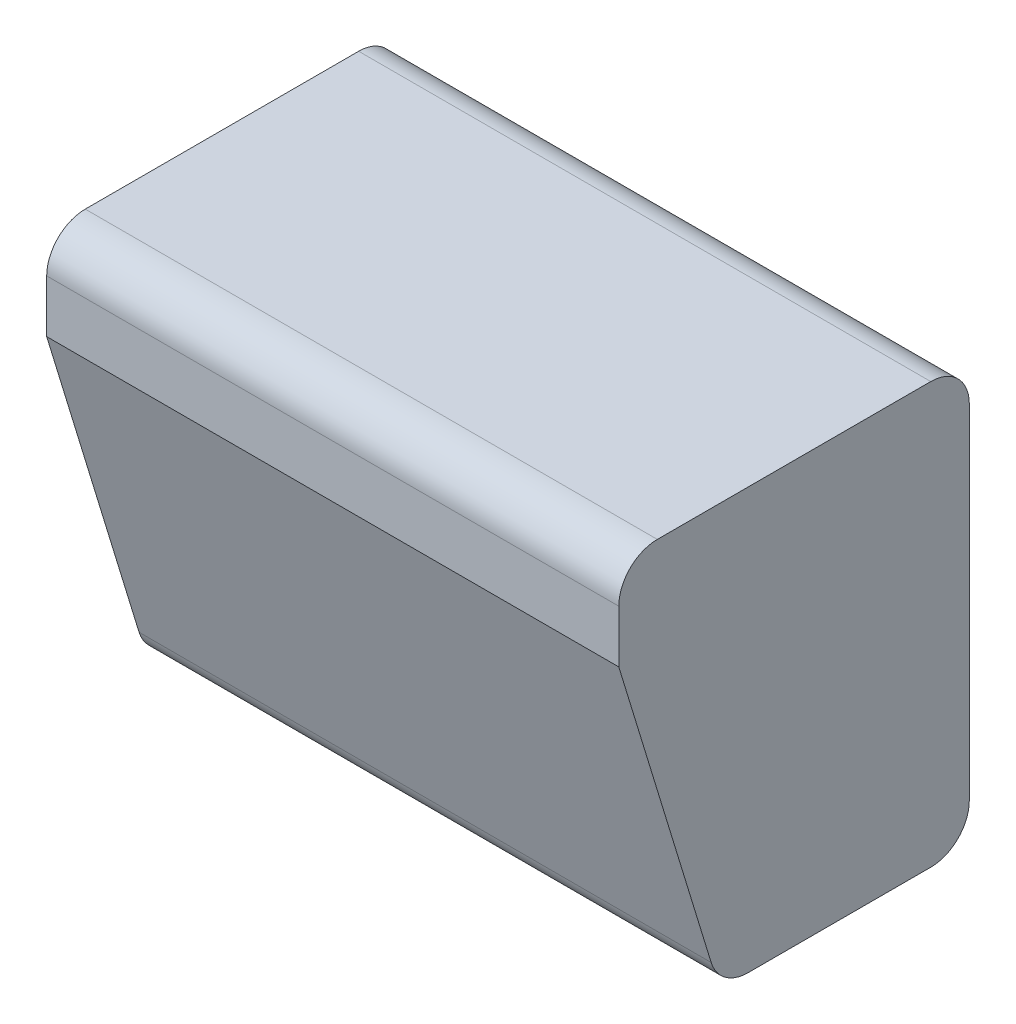
ISO-10303-21;
HEADER;
FILE_DESCRIPTION(('STEP AP214'),'2;1');
FILE_NAME('part.step','',(''),(''),'','','');
FILE_SCHEMA(('AUTOMOTIVE_DESIGN { 1 0 10303 214 1 1 1 1 }'));
ENDSEC;
DATA;
#1=APPLICATION_CONTEXT('core data for automotive mechanical design processes');
#2=APPLICATION_PROTOCOL_DEFINITION('international standard','automotive_design',2000,#1);
#3=PRODUCT_CONTEXT('',#1,'mechanical');
#4=PRODUCT('Part','Part','',(#3));
#5=PRODUCT_RELATED_PRODUCT_CATEGORY('part','',(#4));
#6=PRODUCT_DEFINITION_FORMATION('','',#4);
#7=PRODUCT_DEFINITION_CONTEXT('part definition',#1,'design');
#8=PRODUCT_DEFINITION('design','',#6,#7);
#9=PRODUCT_DEFINITION_SHAPE('','',#8);
#10=(LENGTH_UNIT() NAMED_UNIT(*) SI_UNIT(.MILLI.,.METRE.));
#11=(NAMED_UNIT(*) PLANE_ANGLE_UNIT() SI_UNIT($,.RADIAN.));
#12=(NAMED_UNIT(*) SI_UNIT($,.STERADIAN.) SOLID_ANGLE_UNIT());
#13=UNCERTAINTY_MEASURE_WITH_UNIT(LENGTH_MEASURE(1.E-05),#10,'distance_accuracy_value','');
#14=(GEOMETRIC_REPRESENTATION_CONTEXT(3) GLOBAL_UNCERTAINTY_ASSIGNED_CONTEXT((#13)) GLOBAL_UNIT_ASSIGNED_CONTEXT((#10,
#11,#12)) REPRESENTATION_CONTEXT('',''));
#15=CARTESIAN_POINT('',(0.,0.,0.));
#16=DIRECTION('',(0.,0.,1.));
#17=DIRECTION('',(1.,0.,0.));
#18=AXIS2_PLACEMENT_3D('',#15,#16,#17);
#19=CARTESIAN_POINT('',(81.6,15.1523642732049,27.3204903677758));
#20=DIRECTION('',(0.,0.,-1.));
#21=DIRECTION('',(-1.,0.,0.));
#22=AXIS2_PLACEMENT_3D('',#19,#20,#21);
#23=PLANE('',#22);
#24=DIRECTION('',(0.,-1.,0.));
#25=VECTOR('',#24,1.);
#26=CARTESIAN_POINT('',(81.6,15.1523642732049,27.3204903677758));
#27=LINE('',#26,#25);
#28=CARTESIAN_POINT('',(81.6,22.6523642732049,27.3204903677758));
#29=VERTEX_POINT('',#28);
#30=CARTESIAN_POINT('',(81.6,15.1523642732049,27.3204903677758));
#31=VERTEX_POINT('',#30);
#32=EDGE_CURVE('E117',#29,#31,#27,.T.);
#33=ORIENTED_EDGE('',*,*,#32,.F.);
#34=DIRECTION('',(-1.,0.,0.));
#35=VECTOR('',#34,1.);
#36=CARTESIAN_POINT('',(81.6,22.6523642732049,27.3204903677758));
#37=LINE('',#36,#35);
#38=CARTESIAN_POINT('',(0.,22.6523642732049,27.3204903677758));
#39=VERTEX_POINT('',#38);
#40=EDGE_CURVE('E11',#29,#39,#37,.T.);
#41=ORIENTED_EDGE('',*,*,#40,.T.);
#42=DIRECTION('',(0.,-1.,0.));
#43=VECTOR('',#42,1.);
#44=CARTESIAN_POINT('',(0.,15.1523642732049,27.3204903677758));
#45=LINE('',#44,#43);
#46=CARTESIAN_POINT('',(0.,15.1523642732049,27.3204903677758));
#47=VERTEX_POINT('',#46);
#48=EDGE_CURVE('E141',#39,#47,#45,.T.);
#49=ORIENTED_EDGE('',*,*,#48,.T.);
#50=DIRECTION('',(-1.,0.,0.));
#51=VECTOR('',#50,1.);
#52=CARTESIAN_POINT('',(81.6,15.1523642732049,27.3204903677758));
#53=LINE('',#52,#51);
#54=EDGE_CURVE('E134',#31,#47,#53,.T.);
#55=ORIENTED_EDGE('',*,*,#54,.F.);
#56=EDGE_LOOP('',(#33,#41,#49,#55));
#57=FACE_BOUND('',#56,.T.);
#58=ADVANCED_FACE('F44',(#57),#23,.F.);
#59=CARTESIAN_POINT('',(81.6,-31.8476357267951,12.9511483392189));
#60=DIRECTION('',(0.,0.292371704722734,-0.956304755963036));
#61=DIRECTION('',(0.,0.956304755963036,0.292371704722734));
#62=AXIS2_PLACEMENT_3D('',#59,#60,#61);
#63=PLANE('',#62);
#64=DIRECTION('',(0.,-0.956304755963036,-0.292371704722734));
#65=VECTOR('',#64,1.);
#66=CARTESIAN_POINT('',(0.,-31.8476357267951,12.9511483392189));
#67=LINE('',#66,#65);
#68=CARTESIAN_POINT('',(0.,-27.9556801027701,14.1410385843589));
#69=VERTEX_POINT('',#68);
#70=EDGE_CURVE('E210',#47,#69,#67,.T.);
#71=ORIENTED_EDGE('',*,*,#70,.T.);
#72=DIRECTION('',(-1.,0.,0.));
#73=VECTOR('',#72,1.);
#74=CARTESIAN_POINT('',(81.6,-27.9556801027701,14.1410385843589));
#75=LINE('',#74,#73);
#76=CARTESIAN_POINT('',(81.6,-27.9556801027701,14.1410385843589));
#77=VERTEX_POINT('',#76);
#78=EDGE_CURVE('E136',#69,#77,#75,.F.);
#79=ORIENTED_EDGE('',*,*,#78,.T.);
#80=DIRECTION('',(0.,-0.956304755963036,-0.292371704722734));
#81=VECTOR('',#80,1.);
#82=CARTESIAN_POINT('',(81.6,-31.8476357267951,12.9511483392189));
#83=LINE('',#82,#81);
#84=EDGE_CURVE('E120',#31,#77,#83,.T.);
#85=ORIENTED_EDGE('',*,*,#84,.F.);
#86=ORIENTED_EDGE('',*,*,#54,.T.);
#87=EDGE_LOOP('',(#71,#79,#85,#86));
#88=FACE_BOUND('',#87,.T.);
#89=ADVANCED_FACE('F133',(#88),#63,.F.);
#90=CARTESIAN_POINT('',(81.6,-31.8476357267951,-22.6795096322242));
#91=DIRECTION('',(0.,1.,0.));
#92=DIRECTION('',(0.,0.,1.));
#93=AXIS2_PLACEMENT_3D('',#90,#91,#92);
#94=PLANE('',#93);
#95=DIRECTION('',(0.,0.,-1.));
#96=VECTOR('',#95,1.);
#97=CARTESIAN_POINT('',(81.6,-31.8476357267951,-22.6795096322242));
#98=LINE('',#97,#96);
#99=CARTESIAN_POINT('',(81.6,-31.8476357267951,8.88136242656225));
#100=VERTEX_POINT('',#99);
#101=CARTESIAN_POINT('',(81.6,-31.8476357267951,-17.1795096322242));
#102=VERTEX_POINT('',#101);
#103=EDGE_CURVE('E138',#100,#102,#98,.T.);
#104=ORIENTED_EDGE('',*,*,#103,.F.);
#105=DIRECTION('',(-1.,0.,0.));
#106=VECTOR('',#105,1.);
#107=CARTESIAN_POINT('',(81.6,-31.8476357267951,8.88136242656225));
#108=LINE('',#107,#106);
#109=CARTESIAN_POINT('',(0.,-31.8476357267951,8.88136242656225));
#110=VERTEX_POINT('',#109);
#111=EDGE_CURVE('E149',#100,#110,#108,.T.);
#112=ORIENTED_EDGE('',*,*,#111,.T.);
#113=DIRECTION('',(0.,0.,-1.));
#114=VECTOR('',#113,1.);
#115=CARTESIAN_POINT('',(0.,-31.8476357267951,-22.6795096322242));
#116=LINE('',#115,#114);
#117=CARTESIAN_POINT('',(0.,-31.8476357267951,-17.1795096322242));
#118=VERTEX_POINT('',#117);
#119=EDGE_CURVE('E205',#110,#118,#116,.T.);
#120=ORIENTED_EDGE('',*,*,#119,.T.);
#121=DIRECTION('',(-1.,0.,0.));
#122=VECTOR('',#121,1.);
#123=CARTESIAN_POINT('',(81.6,-31.8476357267951,-17.1795096322242));
#124=LINE('',#123,#122);
#125=EDGE_CURVE('E144',#118,#102,#124,.F.);
#126=ORIENTED_EDGE('',*,*,#125,.T.);
#127=EDGE_LOOP('',(#104,#112,#120,#126));
#128=FACE_BOUND('',#127,.T.);
#129=ADVANCED_FACE('F231',(#128),#94,.F.);
#130=CARTESIAN_POINT('',(81.6,28.1523642732049,-22.6795096322242));
#131=DIRECTION('',(0.,0.,1.));
#132=DIRECTION('',(0.,-1.,0.));
#133=AXIS2_PLACEMENT_3D('',#130,#131,#132);
#134=PLANE('',#133);
#135=DIRECTION('',(0.,1.,0.));
#136=VECTOR('',#135,1.);
#137=CARTESIAN_POINT('',(81.6,28.1523642732049,-22.6795096322242));
#138=LINE('',#137,#136);
#139=CARTESIAN_POINT('',(81.6,-26.3476357267951,-22.6795096322242));
#140=VERTEX_POINT('',#139);
#141=CARTESIAN_POINT('',(81.6,22.6523642732049,-22.6795096322242));
#142=VERTEX_POINT('',#141);
#143=EDGE_CURVE('E151',#140,#142,#138,.T.);
#144=ORIENTED_EDGE('',*,*,#143,.F.);
#145=DIRECTION('',(-1.,0.,0.));
#146=VECTOR('',#145,1.);
#147=CARTESIAN_POINT('',(81.6,-26.3476357267951,-22.6795096322242));
#148=LINE('',#147,#146);
#149=CARTESIAN_POINT('',(0.,-26.3476357267951,-22.6795096322242));
#150=VERTEX_POINT('',#149);
#151=EDGE_CURVE('E186',#140,#150,#148,.T.);
#152=ORIENTED_EDGE('',*,*,#151,.T.);
#153=DIRECTION('',(0.,1.,0.));
#154=VECTOR('',#153,1.);
#155=CARTESIAN_POINT('',(0.,28.1523642732049,-22.6795096322242));
#156=LINE('',#155,#154);
#157=CARTESIAN_POINT('',(0.,22.6523642732049,-22.6795096322242));
#158=VERTEX_POINT('',#157);
#159=EDGE_CURVE('E203',#150,#158,#156,.T.);
#160=ORIENTED_EDGE('',*,*,#159,.T.);
#161=DIRECTION('',(-1.,0.,0.));
#162=VECTOR('',#161,1.);
#163=CARTESIAN_POINT('',(81.6,22.6523642732049,-22.6795096322242));
#164=LINE('',#163,#162);
#165=EDGE_CURVE('E183',#158,#142,#164,.F.);
#166=ORIENTED_EDGE('',*,*,#165,.T.);
#167=EDGE_LOOP('',(#144,#152,#160,#166));
#168=FACE_BOUND('',#167,.T.);
#169=ADVANCED_FACE('F230',(#168),#134,.F.);
#170=CARTESIAN_POINT('',(81.6,28.1523642732049,27.3204903677758));
#171=DIRECTION('',(0.,-1.,0.));
#172=DIRECTION('',(0.,0.,-1.));
#173=AXIS2_PLACEMENT_3D('',#170,#171,#172);
#174=PLANE('',#173);
#175=DIRECTION('',(0.,0.,1.));
#176=VECTOR('',#175,1.);
#177=CARTESIAN_POINT('',(81.6,28.1523642732049,27.3204903677758));
#178=LINE('',#177,#176);
#179=CARTESIAN_POINT('',(81.6,28.1523642732049,-17.1795096322242));
#180=VERTEX_POINT('',#179);
#181=CARTESIAN_POINT('',(81.6,28.1523642732049,21.8204903677758));
#182=VERTEX_POINT('',#181);
#183=EDGE_CURVE('E145',#180,#182,#178,.T.);
#184=ORIENTED_EDGE('',*,*,#183,.F.);
#185=DIRECTION('',(-1.,0.,0.));
#186=VECTOR('',#185,1.);
#187=CARTESIAN_POINT('',(81.6,28.1523642732049,-17.1795096322242));
#188=LINE('',#187,#186);
#189=CARTESIAN_POINT('',(0.,28.1523642732049,-17.1795096322242));
#190=VERTEX_POINT('',#189);
#191=EDGE_CURVE('E53',#180,#190,#188,.T.);
#192=ORIENTED_EDGE('',*,*,#191,.T.);
#193=DIRECTION('',(0.,0.,1.));
#194=VECTOR('',#193,1.);
#195=CARTESIAN_POINT('',(0.,28.1523642732049,27.3204903677758));
#196=LINE('',#195,#194);
#197=CARTESIAN_POINT('',(0.,28.1523642732049,21.8204903677758));
#198=VERTEX_POINT('',#197);
#199=EDGE_CURVE('E128',#190,#198,#196,.T.);
#200=ORIENTED_EDGE('',*,*,#199,.T.);
#201=DIRECTION('',(-1.,0.,0.));
#202=VECTOR('',#201,1.);
#203=CARTESIAN_POINT('',(81.6,28.1523642732049,21.8204903677758));
#204=LINE('',#203,#202);
#205=EDGE_CURVE('E60',#198,#182,#204,.F.);
#206=ORIENTED_EDGE('',*,*,#205,.T.);
#207=EDGE_LOOP('',(#184,#192,#200,#206));
#208=FACE_BOUND('',#207,.T.);
#209=ADVANCED_FACE('F195',(#208),#174,.F.);
#210=CARTESIAN_POINT('',(81.6,0.,0.));
#211=DIRECTION('',(-1.,0.,0.));
#212=DIRECTION('',(0.,0.,1.));
#213=AXIS2_PLACEMENT_3D('',#210,#211,#212);
#214=PLANE('',#213);
#215=ORIENTED_EDGE('',*,*,#84,.T.);
#216=CARTESIAN_POINT('',(81.6,-26.3476357267951,8.88136242656225));
#217=DIRECTION('',(-1.,0.,0.));
#218=DIRECTION('',(0.,0.,1.));
#219=AXIS2_PLACEMENT_3D('',#216,#217,#218);
#220=CIRCLE('',#219,5.5);
#221=EDGE_CURVE('E180',#77,#100,#220,.F.);
#222=ORIENTED_EDGE('',*,*,#221,.T.);
#223=ORIENTED_EDGE('',*,*,#103,.T.);
#224=CARTESIAN_POINT('',(81.6,-26.3476357267951,-17.1795096322242));
#225=DIRECTION('',(-1.,0.,0.));
#226=DIRECTION('',(0.,0.,1.));
#227=AXIS2_PLACEMENT_3D('',#224,#225,#226);
#228=CIRCLE('',#227,5.5);
#229=EDGE_CURVE('E177',#102,#140,#228,.F.);
#230=ORIENTED_EDGE('',*,*,#229,.T.);
#231=ORIENTED_EDGE('',*,*,#143,.T.);
#232=CARTESIAN_POINT('',(81.6,22.6523642732049,-17.1795096322242));
#233=DIRECTION('',(-1.,0.,0.));
#234=DIRECTION('',(0.,0.,1.));
#235=AXIS2_PLACEMENT_3D('',#232,#233,#234);
#236=CIRCLE('',#235,5.5);
#237=EDGE_CURVE('E67',#142,#180,#236,.F.);
#238=ORIENTED_EDGE('',*,*,#237,.T.);
#239=ORIENTED_EDGE('',*,*,#183,.T.);
#240=CARTESIAN_POINT('',(81.6,22.6523642732049,21.8204903677758));
#241=DIRECTION('',(-1.,0.,0.));
#242=DIRECTION('',(0.,0.,1.));
#243=AXIS2_PLACEMENT_3D('',#240,#241,#242);
#244=CIRCLE('',#243,5.5);
#245=EDGE_CURVE('E123',#182,#29,#244,.F.);
#246=ORIENTED_EDGE('',*,*,#245,.T.);
#247=ORIENTED_EDGE('',*,*,#32,.T.);
#248=EDGE_LOOP('',(#215,#222,#223,#230,#231,#238,#239,#246,#247));
#249=FACE_BOUND('',#248,.T.);
#250=ADVANCED_FACE('F119',(#249),#214,.F.);
#251=CARTESIAN_POINT('',(0.,0.,0.));
#252=DIRECTION('',(-1.,0.,0.));
#253=DIRECTION('',(0.,0.,1.));
#254=AXIS2_PLACEMENT_3D('',#251,#252,#253);
#255=PLANE('',#254);
#256=ORIENTED_EDGE('',*,*,#119,.F.);
#257=CARTESIAN_POINT('',(0.,-26.3476357267951,8.88136242656225));
#258=DIRECTION('',(-1.,0.,0.));
#259=DIRECTION('',(0.,0.,1.));
#260=AXIS2_PLACEMENT_3D('',#257,#258,#259);
#261=CIRCLE('',#260,5.5);
#262=EDGE_CURVE('E168',#110,#69,#261,.T.);
#263=ORIENTED_EDGE('',*,*,#262,.T.);
#264=ORIENTED_EDGE('',*,*,#70,.F.);
#265=ORIENTED_EDGE('',*,*,#48,.F.);
#266=CARTESIAN_POINT('',(0.,22.6523642732049,21.8204903677758));
#267=DIRECTION('',(-1.,0.,0.));
#268=DIRECTION('',(0.,0.,1.));
#269=AXIS2_PLACEMENT_3D('',#266,#267,#268);
#270=CIRCLE('',#269,5.5);
#271=EDGE_CURVE('E159',#39,#198,#270,.T.);
#272=ORIENTED_EDGE('',*,*,#271,.T.);
#273=ORIENTED_EDGE('',*,*,#199,.F.);
#274=CARTESIAN_POINT('',(0.,22.6523642732049,-17.1795096322242));
#275=DIRECTION('',(-1.,0.,0.));
#276=DIRECTION('',(0.,0.,1.));
#277=AXIS2_PLACEMENT_3D('',#274,#275,#276);
#278=CIRCLE('',#277,5.5);
#279=EDGE_CURVE('E162',#190,#158,#278,.T.);
#280=ORIENTED_EDGE('',*,*,#279,.T.);
#281=ORIENTED_EDGE('',*,*,#159,.F.);
#282=CARTESIAN_POINT('',(0.,-26.3476357267951,-17.1795096322242));
#283=DIRECTION('',(-1.,0.,0.));
#284=DIRECTION('',(0.,0.,1.));
#285=AXIS2_PLACEMENT_3D('',#282,#283,#284);
#286=CIRCLE('',#285,5.5);
#287=EDGE_CURVE('E165',#150,#118,#286,.T.);
#288=ORIENTED_EDGE('',*,*,#287,.T.);
#289=EDGE_LOOP('',(#256,#263,#264,#265,#272,#273,#280,#281,#288));
#290=FACE_BOUND('',#289,.T.);
#291=ADVANCED_FACE('F199',(#290),#255,.T.);
#292=CARTESIAN_POINT('',(81.6,-26.3476357267951,8.88136242656225));
#293=DIRECTION('',(-1.,0.,0.));
#294=DIRECTION('',(0.,0.,1.));
#295=AXIS2_PLACEMENT_3D('',#292,#293,#294);
#296=CYLINDRICAL_SURFACE('',#295,5.5);
#297=ORIENTED_EDGE('',*,*,#221,.F.);
#298=ORIENTED_EDGE('',*,*,#78,.F.);
#299=ORIENTED_EDGE('',*,*,#262,.F.);
#300=ORIENTED_EDGE('',*,*,#111,.F.);
#301=EDGE_LOOP('',(#297,#298,#299,#300));
#302=FACE_BOUND('',#301,.T.);
#303=ADVANCED_FACE('F233',(#302),#296,.T.);
#304=CARTESIAN_POINT('',(81.6,-26.3476357267951,-17.1795096322242));
#305=DIRECTION('',(-1.,0.,0.));
#306=DIRECTION('',(0.,0.,1.));
#307=AXIS2_PLACEMENT_3D('',#304,#305,#306);
#308=CYLINDRICAL_SURFACE('',#307,5.5);
#309=ORIENTED_EDGE('',*,*,#229,.F.);
#310=ORIENTED_EDGE('',*,*,#125,.F.);
#311=ORIENTED_EDGE('',*,*,#287,.F.);
#312=ORIENTED_EDGE('',*,*,#151,.F.);
#313=EDGE_LOOP('',(#309,#310,#311,#312));
#314=FACE_BOUND('',#313,.T.);
#315=ADVANCED_FACE('F229',(#314),#308,.T.);
#316=CARTESIAN_POINT('',(81.6,22.6523642732049,-17.1795096322242));
#317=DIRECTION('',(-1.,0.,0.));
#318=DIRECTION('',(0.,0.,1.));
#319=AXIS2_PLACEMENT_3D('',#316,#317,#318);
#320=CYLINDRICAL_SURFACE('',#319,5.5);
#321=ORIENTED_EDGE('',*,*,#237,.F.);
#322=ORIENTED_EDGE('',*,*,#165,.F.);
#323=ORIENTED_EDGE('',*,*,#279,.F.);
#324=ORIENTED_EDGE('',*,*,#191,.F.);
#325=EDGE_LOOP('',(#321,#322,#323,#324));
#326=FACE_BOUND('',#325,.T.);
#327=ADVANCED_FACE('F240',(#326),#320,.T.);
#328=CARTESIAN_POINT('',(81.6,22.6523642732049,21.8204903677758));
#329=DIRECTION('',(-1.,0.,0.));
#330=DIRECTION('',(0.,0.,1.));
#331=AXIS2_PLACEMENT_3D('',#328,#329,#330);
#332=CYLINDRICAL_SURFACE('',#331,5.5);
#333=ORIENTED_EDGE('',*,*,#245,.F.);
#334=ORIENTED_EDGE('',*,*,#205,.F.);
#335=ORIENTED_EDGE('',*,*,#271,.F.);
#336=ORIENTED_EDGE('',*,*,#40,.F.);
#337=EDGE_LOOP('',(#333,#334,#335,#336));
#338=FACE_BOUND('',#337,.T.);
#339=ADVANCED_FACE('F46',(#338),#332,.T.);
#340=CLOSED_SHELL('',(#58,#89,#129,#169,#209,#250,#291,#303,#315,#327,#339));
#341=MANIFOLD_SOLID_BREP('B2',#340);
#342=ADVANCED_BREP_SHAPE_REPRESENTATION('',(#18,#341),#14);
#343=SHAPE_DEFINITION_REPRESENTATION(#9,#342);
ENDSEC;
END-ISO-10303-21;
